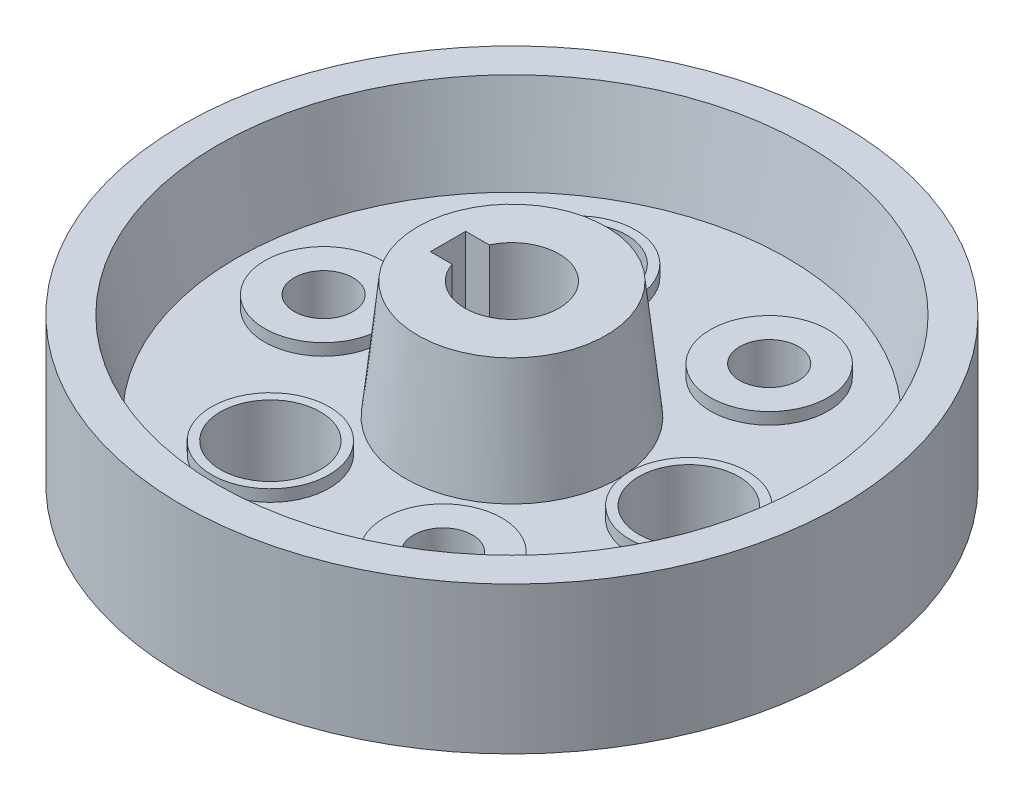
ISO-10303-21;
HEADER;
FILE_DESCRIPTION(('STEP AP214'),'2;1');
FILE_NAME('part.step','',(''),(''),'','','');
FILE_SCHEMA(('AUTOMOTIVE_DESIGN { 1 0 10303 214 1 1 1 1 }'));
ENDSEC;
DATA;
#1=APPLICATION_CONTEXT('core data for automotive mechanical design processes');
#2=APPLICATION_PROTOCOL_DEFINITION('international standard','automotive_design',2000,#1);
#3=PRODUCT_CONTEXT('',#1,'mechanical');
#4=PRODUCT('Part','Part','',(#3));
#5=PRODUCT_RELATED_PRODUCT_CATEGORY('part','',(#4));
#6=PRODUCT_DEFINITION_FORMATION('','',#4);
#7=PRODUCT_DEFINITION_CONTEXT('part definition',#1,'design');
#8=PRODUCT_DEFINITION('design','',#6,#7);
#9=PRODUCT_DEFINITION_SHAPE('','',#8);
#10=(LENGTH_UNIT() NAMED_UNIT(*) SI_UNIT(.MILLI.,.METRE.));
#11=(NAMED_UNIT(*) PLANE_ANGLE_UNIT() SI_UNIT($,.RADIAN.));
#12=(NAMED_UNIT(*) SI_UNIT($,.STERADIAN.) SOLID_ANGLE_UNIT());
#13=UNCERTAINTY_MEASURE_WITH_UNIT(LENGTH_MEASURE(1.E-05),#10,'distance_accuracy_value','');
#14=(GEOMETRIC_REPRESENTATION_CONTEXT(3) GLOBAL_UNCERTAINTY_ASSIGNED_CONTEXT((#13)) GLOBAL_UNIT_ASSIGNED_CONTEXT((#10,
#11,#12)) REPRESENTATION_CONTEXT('',''));
#15=CARTESIAN_POINT('',(0.,0.,0.));
#16=DIRECTION('',(0.,0.,1.));
#17=DIRECTION('',(1.,0.,0.));
#18=AXIS2_PLACEMENT_3D('',#15,#16,#17);
#19=CARTESIAN_POINT('',(56.,30.,0.));
#20=DIRECTION('',(0.,1.,0.));
#21=DIRECTION('',(-1.,0.,0.));
#22=AXIS2_PLACEMENT_3D('',#19,#20,#21);
#23=CYLINDRICAL_SURFACE('',#22,8.);
#24=DIRECTION('',(0.,1.,0.));
#25=VECTOR('',#24,1.);
#26=CARTESIAN_POINT('',(48.7544781875325,0.,-3.39152084838914));
#27=LINE('',#26,#25);
#28=CARTESIAN_POINT('',(48.7544781875325,3.00000000000001,-3.39152084838914));
#29=VERTEX_POINT('',#28);
#30=CARTESIAN_POINT('',(48.7544781875325,30.,-3.39152084838914));
#31=VERTEX_POINT('',#30);
#32=EDGE_CURVE('E108',#29,#31,#27,.T.);
#33=ORIENTED_EDGE('',*,*,#32,.F.);
#34=CARTESIAN_POINT('',(56.,3.00000000000001,0.));
#35=DIRECTION('',(0.,-1.,0.));
#36=DIRECTION('',(1.,0.,0.));
#37=AXIS2_PLACEMENT_3D('',#34,#35,#36);
#38=CIRCLE('',#37,8.);
#39=CARTESIAN_POINT('',(48.4372070955492,3.00000000000001,2.60847915161086));
#40=VERTEX_POINT('',#39);
#41=EDGE_CURVE('E60',#29,#40,#38,.T.);
#42=ORIENTED_EDGE('',*,*,#41,.T.);
#43=DIRECTION('',(0.,1.,0.));
#44=VECTOR('',#43,1.);
#45=CARTESIAN_POINT('',(48.4372070955492,30.,2.60847915161086));
#46=LINE('',#45,#44);
#47=CARTESIAN_POINT('',(48.4372070955492,30.,2.60847915161086));
#48=VERTEX_POINT('',#47);
#49=EDGE_CURVE('E112',#48,#40,#46,.F.);
#50=ORIENTED_EDGE('',*,*,#49,.F.);
#51=CARTESIAN_POINT('',(56.,30.,0.));
#52=DIRECTION('',(0.,1.,0.));
#53=DIRECTION('',(-1.,0.,0.));
#54=AXIS2_PLACEMENT_3D('',#51,#52,#53);
#55=CIRCLE('',#54,8.);
#56=EDGE_CURVE('E150',#48,#31,#55,.T.);
#57=ORIENTED_EDGE('',*,*,#56,.T.);
#58=EDGE_LOOP('',(#33,#42,#50,#57));
#59=FACE_BOUND('',#58,.T.);
#60=ADVANCED_FACE('F45',(#59),#23,.F.);
#61=CARTESIAN_POINT('',(48.7544781875325,0.,2.60847915161086));
#62=DIRECTION('',(0.,0.,1.));
#63=DIRECTION('',(1.,0.,0.));
#64=AXIS2_PLACEMENT_3D('',#61,#62,#63);
#65=PLANE('',#64);
#66=DIRECTION('',(1.,0.,0.));
#67=VECTOR('',#66,1.);
#68=CARTESIAN_POINT('',(48.7544781875325,3.00000000000001,2.60847915161086));
#69=LINE('',#68,#67);
#70=CARTESIAN_POINT('',(44.7562477490535,3.00000000000001,2.60847915161086));
#71=VERTEX_POINT('',#70);
#72=EDGE_CURVE('E100',#71,#40,#69,.T.);
#73=ORIENTED_EDGE('',*,*,#72,.F.);
#74=DIRECTION('',(0.,1.,0.));
#75=VECTOR('',#74,1.);
#76=CARTESIAN_POINT('',(44.7562477490535,0.,2.60847915161086));
#77=LINE('',#76,#75);
#78=CARTESIAN_POINT('',(44.7562477490535,30.,2.60847915161086));
#79=VERTEX_POINT('',#78);
#80=EDGE_CURVE('E98',#71,#79,#77,.T.);
#81=ORIENTED_EDGE('',*,*,#80,.T.);
#82=DIRECTION('',(1.,0.,0.));
#83=VECTOR('',#82,1.);
#84=CARTESIAN_POINT('',(48.7544781875325,30.,2.60847915161086));
#85=LINE('',#84,#83);
#86=EDGE_CURVE('E68',#79,#48,#85,.T.);
#87=ORIENTED_EDGE('',*,*,#86,.T.);
#88=ORIENTED_EDGE('',*,*,#49,.T.);
#89=EDGE_LOOP('',(#73,#81,#87,#88));
#90=FACE_BOUND('',#89,.T.);
#91=ADVANCED_FACE('F290',(#90),#65,.F.);
#92=CARTESIAN_POINT('',(44.7562477490535,0.,-3.39152084838914));
#93=DIRECTION('',(-1.,0.,0.));
#94=DIRECTION('',(0.,-1.,0.));
#95=AXIS2_PLACEMENT_3D('',#92,#93,#94);
#96=PLANE('',#95);
#97=DIRECTION('',(0.,0.,1.));
#98=VECTOR('',#97,1.);
#99=CARTESIAN_POINT('',(44.7562477490535,3.00000000000001,-3.39152084838914));
#100=LINE('',#99,#98);
#101=CARTESIAN_POINT('',(44.7562477490535,3.00000000000001,-3.39152084838914));
#102=VERTEX_POINT('',#101);
#103=EDGE_CURVE('E87',#102,#71,#100,.T.);
#104=ORIENTED_EDGE('',*,*,#103,.F.);
#105=DIRECTION('',(0.,1.,0.));
#106=VECTOR('',#105,1.);
#107=CARTESIAN_POINT('',(44.7562477490535,0.,-3.39152084838914));
#108=LINE('',#107,#106);
#109=CARTESIAN_POINT('',(44.7562477490535,30.,-3.39152084838914));
#110=VERTEX_POINT('',#109);
#111=EDGE_CURVE('E96',#102,#110,#108,.T.);
#112=ORIENTED_EDGE('',*,*,#111,.T.);
#113=DIRECTION('',(0.,0.,1.));
#114=VECTOR('',#113,1.);
#115=CARTESIAN_POINT('',(44.7562477490535,30.,-3.39152084838914));
#116=LINE('',#115,#114);
#117=EDGE_CURVE('E282',#110,#79,#116,.T.);
#118=ORIENTED_EDGE('',*,*,#117,.T.);
#119=ORIENTED_EDGE('',*,*,#80,.F.);
#120=EDGE_LOOP('',(#104,#112,#118,#119));
#121=FACE_BOUND('',#120,.T.);
#122=ADVANCED_FACE('F94',(#121),#96,.F.);
#123=CARTESIAN_POINT('',(48.7544781875325,0.,-3.39152084838914));
#124=DIRECTION('',(0.,0.,-1.));
#125=DIRECTION('',(-1.,0.,0.));
#126=AXIS2_PLACEMENT_3D('',#123,#124,#125);
#127=PLANE('',#126);
#128=DIRECTION('',(-1.,0.,0.));
#129=VECTOR('',#128,1.);
#130=CARTESIAN_POINT('',(48.7544781875325,3.00000000000001,-3.39152084838914));
#131=LINE('',#130,#129);
#132=EDGE_CURVE('E11',#29,#102,#131,.T.);
#133=ORIENTED_EDGE('',*,*,#132,.F.);
#134=ORIENTED_EDGE('',*,*,#32,.T.);
#135=DIRECTION('',(-1.,0.,0.));
#136=VECTOR('',#135,1.);
#137=CARTESIAN_POINT('',(48.7544781875325,30.,-3.39152084838914));
#138=LINE('',#137,#136);
#139=EDGE_CURVE('E105',#31,#110,#138,.T.);
#140=ORIENTED_EDGE('',*,*,#139,.T.);
#141=ORIENTED_EDGE('',*,*,#111,.F.);
#142=EDGE_LOOP('',(#133,#134,#140,#141));
#143=FACE_BOUND('',#142,.T.);
#144=ADVANCED_FACE('F103',(#143),#127,.F.);
#145=CARTESIAN_POINT('',(32.8666864261042,10.,0.));
#146=DIRECTION('',(0.,1.,0.));
#147=DIRECTION('',(-1.,0.,0.));
#148=AXIS2_PLACEMENT_3D('',#145,#146,#147);
#149=PLANE('',#148);
#150=CARTESIAN_POINT('',(72.0000000000001,10.,27.712812921102));
#151=DIRECTION('',(0.,1.,0.));
#152=DIRECTION('',(0.500000000000004,0.,0.866025403784436));
#153=AXIS2_PLACEMENT_3D('',#150,#151,#152);
#154=CIRCLE('',#153,10.);
#155=CARTESIAN_POINT('',(77.0000000000002,10.,36.3730669589463));
#156=VERTEX_POINT('',#155);
#157=EDGE_CURVE('E212',#156,#156,#154,.T.);
#158=ORIENTED_EDGE('',*,*,#157,.F.);
#159=EDGE_LOOP('',(#158));
#160=FACE_BOUND('',#159,.T.);
#161=CARTESIAN_POINT('',(56.,10.,0.));
#162=DIRECTION('',(0.,1.,0.));
#163=DIRECTION('',(-1.,0.,0.));
#164=AXIS2_PLACEMENT_3D('',#161,#162,#163);
#165=CIRCLE('',#164,18.1333135738958);
#166=CARTESIAN_POINT('',(37.8666864261042,10.,0.));
#167=VERTEX_POINT('',#166);
#168=EDGE_CURVE('E158',#167,#167,#165,.T.);
#169=ORIENTED_EDGE('',*,*,#168,.F.);
#170=EDGE_LOOP('',(#169));
#171=FACE_BOUND('',#170,.T.);
#172=CARTESIAN_POINT('',(56.,10.,0.));
#173=DIRECTION('',(0.,1.,0.));
#174=DIRECTION('',(-1.,0.,0.));
#175=AXIS2_PLACEMENT_3D('',#172,#173,#174);
#176=CIRCLE('',#175,46.7764705882353);
#177=CARTESIAN_POINT('',(9.22352941176471,10.,0.));
#178=VERTEX_POINT('',#177);
#179=EDGE_CURVE('E162',#178,#178,#176,.T.);
#180=ORIENTED_EDGE('',*,*,#179,.T.);
#181=EDGE_LOOP('',(#180));
#182=FACE_BOUND('',#181,.T.);
#183=CARTESIAN_POINT('',(40.9772805385395,10.,-26.0201133751031));
#184=DIRECTION('',(0.,1.,0.));
#185=DIRECTION('',(-1.,0.,0.));
#186=AXIS2_PLACEMENT_3D('',#183,#184,#185);
#187=CIRCLE('',#186,10.);
#188=CARTESIAN_POINT('',(30.9772805385395,10.,-26.0201133751031));
#189=VERTEX_POINT('',#188);
#190=EDGE_CURVE('E257',#189,#189,#187,.T.);
#191=ORIENTED_EDGE('',*,*,#190,.F.);
#192=EDGE_LOOP('',(#191));
#193=FACE_BOUND('',#192,.T.);
#194=CARTESIAN_POINT('',(86.0454389229208,10.,-4.30211422042248E-13));
#195=DIRECTION('',(0.,1.,0.));
#196=DIRECTION('',(-1.,0.,0.));
#197=AXIS2_PLACEMENT_3D('',#194,#195,#196);
#198=CIRCLE('',#197,9.99999999999999);
#199=CARTESIAN_POINT('',(76.0454389229208,10.,-4.30211422042248E-13));
#200=VERTEX_POINT('',#199);
#201=EDGE_CURVE('E253',#200,#200,#198,.T.);
#202=ORIENTED_EDGE('',*,*,#201,.F.);
#203=EDGE_LOOP('',(#202));
#204=FACE_BOUND('',#203,.T.);
#205=CARTESIAN_POINT('',(40.9772805385398,10.,26.0201133751034));
#206=DIRECTION('',(0.,1.,0.));
#207=DIRECTION('',(-1.,0.,0.));
#208=AXIS2_PLACEMENT_3D('',#205,#206,#207);
#209=CIRCLE('',#208,10.);
#210=CARTESIAN_POINT('',(30.9772805385398,10.,26.0201133751034));
#211=VERTEX_POINT('',#210);
#212=EDGE_CURVE('E245',#211,#211,#209,.T.);
#213=ORIENTED_EDGE('',*,*,#212,.F.);
#214=EDGE_LOOP('',(#213));
#215=FACE_BOUND('',#214,.T.);
#216=CARTESIAN_POINT('',(24.,10.,0.));
#217=DIRECTION('',(0.,1.,0.));
#218=DIRECTION('',(-1.,0.,0.));
#219=AXIS2_PLACEMENT_3D('',#216,#217,#218);
#220=CIRCLE('',#219,10.);
#221=CARTESIAN_POINT('',(14.,10.,0.));
#222=VERTEX_POINT('',#221);
#223=EDGE_CURVE('E224',#222,#222,#220,.T.);
#224=ORIENTED_EDGE('',*,*,#223,.F.);
#225=EDGE_LOOP('',(#224));
#226=FACE_BOUND('',#225,.T.);
#227=CARTESIAN_POINT('',(71.9999999999997,10.,-27.7128129211022));
#228=DIRECTION('',(0.,1.,0.));
#229=DIRECTION('',(0.499999999999992,0.,-0.866025403784443));
#230=AXIS2_PLACEMENT_3D('',#227,#228,#229);
#231=CIRCLE('',#230,10.);
#232=CARTESIAN_POINT('',(76.9999999999997,10.,-36.3730669589466));
#233=VERTEX_POINT('',#232);
#234=EDGE_CURVE('E195',#233,#233,#231,.T.);
#235=ORIENTED_EDGE('',*,*,#234,.F.);
#236=EDGE_LOOP('',(#235));
#237=FACE_BOUND('',#236,.T.);
#238=ADVANCED_FACE('F188',(#160,#171,#182,#193,#204,#215,#226,#237),#149,.T.);
#239=CARTESIAN_POINT('',(71.9999999999997,-20.,-27.7128129211022));
#240=DIRECTION('',(0.,1.,0.));
#241=DIRECTION('',(-1.,0.,0.));
#242=AXIS2_PLACEMENT_3D('',#239,#240,#241);
#243=CYLINDRICAL_SURFACE('',#242,5.);
#244=CARTESIAN_POINT('',(71.9999999999997,2.00000000000002,-27.7128129211022));
#245=DIRECTION('',(0.,-1.,0.));
#246=DIRECTION('',(1.,0.,0.));
#247=AXIS2_PLACEMENT_3D('',#244,#245,#246);
#248=CIRCLE('',#247,5.);
#249=CARTESIAN_POINT('',(76.9999999999997,2.00000000000002,-27.7128129211022));
#250=VERTEX_POINT('',#249);
#251=EDGE_CURVE('E145',#250,#250,#248,.F.);
#252=ORIENTED_EDGE('',*,*,#251,.F.);
#253=EDGE_LOOP('',(#252));
#254=FACE_BOUND('',#253,.T.);
#255=CARTESIAN_POINT('',(71.9999999999997,12.,-27.7128129211022));
#256=DIRECTION('',(0.,1.,0.));
#257=DIRECTION('',(0.499999999999992,0.,-0.866025403784443));
#258=AXIS2_PLACEMENT_3D('',#255,#256,#257);
#259=CIRCLE('',#258,5.);
#260=CARTESIAN_POINT('',(74.4999999999997,12.,-32.0429399400244));
#261=VERTEX_POINT('',#260);
#262=EDGE_CURVE('E192',#261,#261,#259,.T.);
#263=ORIENTED_EDGE('',*,*,#262,.T.);
#264=EDGE_LOOP('',(#263));
#265=FACE_BOUND('',#264,.T.);
#266=ADVANCED_FACE('F184',(#254,#265),#243,.F.);
#267=CARTESIAN_POINT('',(72.0000000000001,-20.,27.712812921102));
#268=DIRECTION('',(0.,1.,0.));
#269=DIRECTION('',(-1.,0.,0.));
#270=AXIS2_PLACEMENT_3D('',#267,#268,#269);
#271=CYLINDRICAL_SURFACE('',#270,5.);
#272=CARTESIAN_POINT('',(72.0000000000001,2.00000000000002,27.712812921102));
#273=DIRECTION('',(0.,-1.,0.));
#274=DIRECTION('',(1.,0.,0.));
#275=AXIS2_PLACEMENT_3D('',#272,#273,#274);
#276=CIRCLE('',#275,5.);
#277=CARTESIAN_POINT('',(77.0000000000001,2.00000000000002,27.712812921102));
#278=VERTEX_POINT('',#277);
#279=EDGE_CURVE('E124',#278,#278,#276,.F.);
#280=ORIENTED_EDGE('',*,*,#279,.F.);
#281=EDGE_LOOP('',(#280));
#282=FACE_BOUND('',#281,.T.);
#283=CARTESIAN_POINT('',(72.0000000000001,12.,27.712812921102));
#284=DIRECTION('',(0.,1.,0.));
#285=DIRECTION('',(0.500000000000004,0.,0.866025403784436));
#286=AXIS2_PLACEMENT_3D('',#283,#284,#285);
#287=CIRCLE('',#286,5.);
#288=CARTESIAN_POINT('',(74.5000000000001,12.,32.0429399400241));
#289=VERTEX_POINT('',#288);
#290=EDGE_CURVE('E207',#289,#289,#287,.T.);
#291=ORIENTED_EDGE('',*,*,#290,.T.);
#292=EDGE_LOOP('',(#291));
#293=FACE_BOUND('',#292,.T.);
#294=ADVANCED_FACE('F187',(#282,#293),#271,.F.);
#295=CARTESIAN_POINT('',(24.,-20.,0.));
#296=DIRECTION('',(0.,1.,0.));
#297=DIRECTION('',(-1.,0.,0.));
#298=AXIS2_PLACEMENT_3D('',#295,#296,#297);
#299=CYLINDRICAL_SURFACE('',#298,5.);
#300=CARTESIAN_POINT('',(24.,2.00000000000001,0.));
#301=DIRECTION('',(0.,-1.,0.));
#302=DIRECTION('',(1.,0.,0.));
#303=AXIS2_PLACEMENT_3D('',#300,#301,#302);
#304=CIRCLE('',#303,5.);
#305=CARTESIAN_POINT('',(29.,2.00000000000001,0.));
#306=VERTEX_POINT('',#305);
#307=EDGE_CURVE('E140',#306,#306,#304,.F.);
#308=ORIENTED_EDGE('',*,*,#307,.F.);
#309=EDGE_LOOP('',(#308));
#310=FACE_BOUND('',#309,.T.);
#311=CARTESIAN_POINT('',(24.,12.,0.));
#312=DIRECTION('',(0.,1.,0.));
#313=DIRECTION('',(-1.,0.,0.));
#314=AXIS2_PLACEMENT_3D('',#311,#312,#313);
#315=CIRCLE('',#314,5.);
#316=CARTESIAN_POINT('',(19.,12.,0.));
#317=VERTEX_POINT('',#316);
#318=EDGE_CURVE('E217',#317,#317,#315,.T.);
#319=ORIENTED_EDGE('',*,*,#318,.T.);
#320=EDGE_LOOP('',(#319));
#321=FACE_BOUND('',#320,.T.);
#322=ADVANCED_FACE('F330',(#310,#321),#299,.F.);
#323=CARTESIAN_POINT('',(56.,30.,0.));
#324=DIRECTION('',(0.,1.,0.));
#325=DIRECTION('',(-1.,0.,0.));
#326=AXIS2_PLACEMENT_3D('',#323,#324,#325);
#327=CYLINDRICAL_SURFACE('',#326,56.);
#328=CARTESIAN_POINT('',(56.,0.,0.));
#329=DIRECTION('',(0.,1.,0.));
#330=DIRECTION('',(-1.,0.,0.));
#331=AXIS2_PLACEMENT_3D('',#328,#329,#330);
#332=CIRCLE('',#331,56.);
#333=CARTESIAN_POINT('',(0.,0.,0.));
#334=VERTEX_POINT('',#333);
#335=EDGE_CURVE('E146',#334,#334,#332,.T.);
#336=ORIENTED_EDGE('',*,*,#335,.T.);
#337=EDGE_LOOP('',(#336));
#338=FACE_BOUND('',#337,.T.);
#339=CARTESIAN_POINT('',(56.,25.,0.));
#340=DIRECTION('',(0.,1.,0.));
#341=DIRECTION('',(-1.,0.,0.));
#342=AXIS2_PLACEMENT_3D('',#339,#340,#341);
#343=CIRCLE('',#342,56.);
#344=CARTESIAN_POINT('',(0.,25.,0.));
#345=VERTEX_POINT('',#344);
#346=EDGE_CURVE('E54',#345,#345,#343,.T.);
#347=ORIENTED_EDGE('',*,*,#346,.F.);
#348=EDGE_LOOP('',(#347));
#349=FACE_BOUND('',#348,.T.);
#350=ADVANCED_FACE('F47',(#338,#349),#327,.T.);
#351=CARTESIAN_POINT('',(0.,25.,0.));
#352=DIRECTION('',(0.,1.,0.));
#353=DIRECTION('',(-1.,0.,0.));
#354=AXIS2_PLACEMENT_3D('',#351,#352,#353);
#355=PLANE('',#354);
#356=ORIENTED_EDGE('',*,*,#346,.T.);
#357=EDGE_LOOP('',(#356));
#358=FACE_BOUND('',#357,.T.);
#359=CARTESIAN_POINT('',(56.,25.,0.));
#360=DIRECTION('',(0.,1.,0.));
#361=DIRECTION('',(-1.,0.,0.));
#362=AXIS2_PLACEMENT_3D('',#359,#360,#361);
#363=CIRCLE('',#362,50.);
#364=CARTESIAN_POINT('',(6.,25.,0.));
#365=VERTEX_POINT('',#364);
#366=EDGE_CURVE('E166',#365,#365,#363,.T.);
#367=ORIENTED_EDGE('',*,*,#366,.F.);
#368=EDGE_LOOP('',(#367));
#369=FACE_BOUND('',#368,.T.);
#370=ADVANCED_FACE('F329',(#358,#369),#355,.T.);
#371=CARTESIAN_POINT('',(56.,10.,0.));
#372=DIRECTION('',(0.,1.,0.));
#373=DIRECTION('',(-1.,0.,0.));
#374=AXIS2_PLACEMENT_3D('',#371,#372,#373);
#375=CONICAL_SURFACE('',#374,46.7764705882353,0.211682450549624);
#376=ORIENTED_EDGE('',*,*,#366,.T.);
#377=EDGE_LOOP('',(#376));
#378=FACE_BOUND('',#377,.T.);
#379=ORIENTED_EDGE('',*,*,#179,.F.);
#380=EDGE_LOOP('',(#379));
#381=FACE_BOUND('',#380,.T.);
#382=ADVANCED_FACE('F335',(#378,#381),#375,.F.);
#383=CARTESIAN_POINT('',(56.,30.,0.));
#384=DIRECTION('',(0.,-1.,0.));
#385=DIRECTION('',(1.,0.,0.));
#386=AXIS2_PLACEMENT_3D('',#383,#384,#385);
#387=CONICAL_SURFACE('',#386,16.,0.106263886033565);
#388=ORIENTED_EDGE('',*,*,#168,.T.);
#389=EDGE_LOOP('',(#388));
#390=FACE_BOUND('',#389,.T.);
#391=CARTESIAN_POINT('',(56.,30.,0.));
#392=DIRECTION('',(0.,1.,0.));
#393=DIRECTION('',(-1.,0.,0.));
#394=AXIS2_PLACEMENT_3D('',#391,#392,#393);
#395=CIRCLE('',#394,16.);
#396=CARTESIAN_POINT('',(40.,30.,0.));
#397=VERTEX_POINT('',#396);
#398=EDGE_CURVE('E154',#397,#397,#395,.T.);
#399=ORIENTED_EDGE('',*,*,#398,.F.);
#400=EDGE_LOOP('',(#399));
#401=FACE_BOUND('',#400,.T.);
#402=ADVANCED_FACE('F340',(#390,#401),#387,.T.);
#403=CARTESIAN_POINT('',(40.,30.,0.));
#404=DIRECTION('',(0.,1.,0.));
#405=DIRECTION('',(-1.,0.,0.));
#406=AXIS2_PLACEMENT_3D('',#403,#404,#405);
#407=PLANE('',#406);
#408=ORIENTED_EDGE('',*,*,#86,.F.);
#409=ORIENTED_EDGE('',*,*,#117,.F.);
#410=ORIENTED_EDGE('',*,*,#139,.F.);
#411=ORIENTED_EDGE('',*,*,#56,.F.);
#412=EDGE_LOOP('',(#408,#409,#410,#411));
#413=FACE_BOUND('',#412,.T.);
#414=ORIENTED_EDGE('',*,*,#398,.T.);
#415=EDGE_LOOP('',(#414));
#416=FACE_BOUND('',#415,.T.);
#417=ADVANCED_FACE('F287',(#413,#416),#407,.T.);
#418=CARTESIAN_POINT('',(0.,0.,0.));
#419=DIRECTION('',(0.,-1.,0.));
#420=DIRECTION('',(1.,0.,0.));
#421=AXIS2_PLACEMENT_3D('',#418,#419,#420);
#422=PLANE('',#421);
#423=CARTESIAN_POINT('',(56.,0.,0.));
#424=DIRECTION('',(0.,-1.,0.));
#425=DIRECTION('',(1.,0.,0.));
#426=AXIS2_PLACEMENT_3D('',#423,#424,#425);
#427=CIRCLE('',#426,17.5);
#428=CARTESIAN_POINT('',(73.5,0.,0.));
#429=VERTEX_POINT('',#428);
#430=EDGE_CURVE('E293',#429,#429,#427,.T.);
#431=ORIENTED_EDGE('',*,*,#430,.F.);
#432=EDGE_LOOP('',(#431));
#433=FACE_BOUND('',#432,.T.);
#434=CARTESIAN_POINT('',(40.9772805385398,0.,26.0201133751034));
#435=DIRECTION('',(0.,1.,0.));
#436=DIRECTION('',(0.500000000000004,0.,0.866025403784436));
#437=AXIS2_PLACEMENT_3D('',#434,#435,#436);
#438=CIRCLE('',#437,8.50000000000001);
#439=CARTESIAN_POINT('',(45.2272805385399,0.,33.3813293072711));
#440=VERTEX_POINT('',#439);
#441=EDGE_CURVE('E269',#440,#440,#438,.T.);
#442=ORIENTED_EDGE('',*,*,#441,.T.);
#443=EDGE_LOOP('',(#442));
#444=FACE_BOUND('',#443,.T.);
#445=CARTESIAN_POINT('',(86.0454389229208,0.,-4.30191391180932E-13));
#446=DIRECTION('',(0.,1.,0.));
#447=DIRECTION('',(0.499999999999992,0.,-0.866025403784443));
#448=AXIS2_PLACEMENT_3D('',#445,#446,#447);
#449=CIRCLE('',#448,8.50000000000001);
#450=CARTESIAN_POINT('',(90.2954389229208,0.,-7.36121593216821));
#451=VERTEX_POINT('',#450);
#452=EDGE_CURVE('E265',#451,#451,#449,.T.);
#453=ORIENTED_EDGE('',*,*,#452,.T.);
#454=EDGE_LOOP('',(#453));
#455=FACE_BOUND('',#454,.T.);
#456=CARTESIAN_POINT('',(40.9772805385395,0.,-26.0201133751031));
#457=DIRECTION('',(0.,1.,0.));
#458=DIRECTION('',(-1.,0.,0.));
#459=AXIS2_PLACEMENT_3D('',#456,#457,#458);
#460=CIRCLE('',#459,8.50000000000001);
#461=CARTESIAN_POINT('',(32.4772805385394,0.,-26.0201133751031));
#462=VERTEX_POINT('',#461);
#463=EDGE_CURVE('E273',#462,#462,#460,.T.);
#464=ORIENTED_EDGE('',*,*,#463,.T.);
#465=EDGE_LOOP('',(#464));
#466=FACE_BOUND('',#465,.T.);
#467=CARTESIAN_POINT('',(72.0000000000001,0.,27.712812921102));
#468=DIRECTION('',(0.,-1.,0.));
#469=DIRECTION('',(-0.500000000000004,0.,-0.866025403784436));
#470=AXIS2_PLACEMENT_3D('',#467,#468,#469);
#471=CIRCLE('',#470,6.);
#472=CARTESIAN_POINT('',(69.0000000000001,0.,22.5166604983953));
#473=VERTEX_POINT('',#472);
#474=EDGE_CURVE('E125',#473,#473,#471,.T.);
#475=ORIENTED_EDGE('',*,*,#474,.F.);
#476=EDGE_LOOP('',(#475));
#477=FACE_BOUND('',#476,.T.);
#478=CARTESIAN_POINT('',(71.9999999999997,0.,-27.7128129211022));
#479=DIRECTION('',(0.,-1.,0.));
#480=DIRECTION('',(-0.499999999999992,0.,0.866025403784443));
#481=AXIS2_PLACEMENT_3D('',#478,#479,#480);
#482=CIRCLE('',#481,6.);
#483=CARTESIAN_POINT('',(68.9999999999998,0.,-22.5166604983955));
#484=VERTEX_POINT('',#483);
#485=EDGE_CURVE('E119',#484,#484,#482,.T.);
#486=ORIENTED_EDGE('',*,*,#485,.F.);
#487=EDGE_LOOP('',(#486));
#488=FACE_BOUND('',#487,.T.);
#489=CARTESIAN_POINT('',(24.,0.,0.));
#490=DIRECTION('',(0.,-1.,0.));
#491=DIRECTION('',(1.,0.,0.));
#492=AXIS2_PLACEMENT_3D('',#489,#490,#491);
#493=CIRCLE('',#492,6.);
#494=CARTESIAN_POINT('',(30.,0.,0.));
#495=VERTEX_POINT('',#494);
#496=EDGE_CURVE('E141',#495,#495,#493,.T.);
#497=ORIENTED_EDGE('',*,*,#496,.F.);
#498=EDGE_LOOP('',(#497));
#499=FACE_BOUND('',#498,.T.);
#500=ORIENTED_EDGE('',*,*,#335,.F.);
#501=EDGE_LOOP('',(#500));
#502=FACE_BOUND('',#501,.T.);
#503=ADVANCED_FACE('F308',(#433,#444,#455,#466,#477,#488,#499,#502),#422,.T.);
#504=CARTESIAN_POINT('',(24.,2.00000000000001,0.));
#505=DIRECTION('',(0.,-1.,0.));
#506=DIRECTION('',(1.,0.,0.));
#507=AXIS2_PLACEMENT_3D('',#504,#505,#506);
#508=PLANE('',#507);
#509=CARTESIAN_POINT('',(24.,2.00000000000001,0.));
#510=DIRECTION('',(0.,-1.,0.));
#511=DIRECTION('',(1.,0.,0.));
#512=AXIS2_PLACEMENT_3D('',#509,#510,#511);
#513=CIRCLE('',#512,6.);
#514=CARTESIAN_POINT('',(30.,2.00000000000001,0.));
#515=VERTEX_POINT('',#514);
#516=EDGE_CURVE('E136',#515,#515,#513,.T.);
#517=ORIENTED_EDGE('',*,*,#516,.T.);
#518=EDGE_LOOP('',(#517));
#519=FACE_BOUND('',#518,.T.);
#520=ORIENTED_EDGE('',*,*,#307,.T.);
#521=EDGE_LOOP('',(#520));
#522=FACE_BOUND('',#521,.T.);
#523=ADVANCED_FACE('F311',(#519,#522),#508,.T.);
#524=CARTESIAN_POINT('',(24.,2.00000000000001,0.));
#525=DIRECTION('',(0.,-1.,0.));
#526=DIRECTION('',(1.,0.,0.));
#527=AXIS2_PLACEMENT_3D('',#524,#525,#526);
#528=CYLINDRICAL_SURFACE('',#527,6.);
#529=ORIENTED_EDGE('',*,*,#516,.F.);
#530=EDGE_LOOP('',(#529));
#531=FACE_BOUND('',#530,.T.);
#532=ORIENTED_EDGE('',*,*,#496,.T.);
#533=EDGE_LOOP('',(#532));
#534=FACE_BOUND('',#533,.T.);
#535=ADVANCED_FACE('F404',(#531,#534),#528,.F.);
#536=CARTESIAN_POINT('',(72.0000000000001,2.00000000000002,27.712812921102));
#537=DIRECTION('',(0.,-1.,0.));
#538=DIRECTION('',(-0.500000000000004,0.,-0.866025403784436));
#539=AXIS2_PLACEMENT_3D('',#536,#537,#538);
#540=PLANE('',#539);
#541=CARTESIAN_POINT('',(72.0000000000001,2.00000000000002,27.712812921102));
#542=DIRECTION('',(0.,-1.,0.));
#543=DIRECTION('',(-0.500000000000004,0.,-0.866025403784436));
#544=AXIS2_PLACEMENT_3D('',#541,#542,#543);
#545=CIRCLE('',#544,6.);
#546=CARTESIAN_POINT('',(69.0000000000001,2.00000000000002,22.5166604983953));
#547=VERTEX_POINT('',#546);
#548=EDGE_CURVE('E120',#547,#547,#545,.T.);
#549=ORIENTED_EDGE('',*,*,#548,.T.);
#550=EDGE_LOOP('',(#549));
#551=FACE_BOUND('',#550,.T.);
#552=ORIENTED_EDGE('',*,*,#279,.T.);
#553=EDGE_LOOP('',(#552));
#554=FACE_BOUND('',#553,.T.);
#555=ADVANCED_FACE('F412',(#551,#554),#540,.T.);
#556=CARTESIAN_POINT('',(72.0000000000001,2.00000000000002,27.712812921102));
#557=DIRECTION('',(0.,-1.,0.));
#558=DIRECTION('',(1.,0.,0.));
#559=AXIS2_PLACEMENT_3D('',#556,#557,#558);
#560=CYLINDRICAL_SURFACE('',#559,6.);
#561=ORIENTED_EDGE('',*,*,#548,.F.);
#562=EDGE_LOOP('',(#561));
#563=FACE_BOUND('',#562,.T.);
#564=ORIENTED_EDGE('',*,*,#474,.T.);
#565=EDGE_LOOP('',(#564));
#566=FACE_BOUND('',#565,.T.);
#567=ADVANCED_FACE('F420',(#563,#566),#560,.F.);
#568=CARTESIAN_POINT('',(71.9999999999997,2.00000000000002,-27.7128129211022));
#569=DIRECTION('',(0.,-1.,0.));
#570=DIRECTION('',(-0.499999999999992,0.,0.866025403784443));
#571=AXIS2_PLACEMENT_3D('',#568,#569,#570);
#572=PLANE('',#571);
#573=CARTESIAN_POINT('',(71.9999999999997,2.00000000000002,-27.7128129211022));
#574=DIRECTION('',(0.,-1.,0.));
#575=DIRECTION('',(-0.499999999999992,0.,0.866025403784443));
#576=AXIS2_PLACEMENT_3D('',#573,#574,#575);
#577=CIRCLE('',#576,6.);
#578=CARTESIAN_POINT('',(68.9999999999998,2.00000000000002,-22.5166604983955));
#579=VERTEX_POINT('',#578);
#580=EDGE_CURVE('E129',#579,#579,#577,.T.);
#581=ORIENTED_EDGE('',*,*,#580,.T.);
#582=EDGE_LOOP('',(#581));
#583=FACE_BOUND('',#582,.T.);
#584=ORIENTED_EDGE('',*,*,#251,.T.);
#585=EDGE_LOOP('',(#584));
#586=FACE_BOUND('',#585,.T.);
#587=ADVANCED_FACE('F182',(#583,#586),#572,.T.);
#588=CARTESIAN_POINT('',(71.9999999999997,2.00000000000002,-27.7128129211022));
#589=DIRECTION('',(0.,-1.,0.));
#590=DIRECTION('',(1.,0.,0.));
#591=AXIS2_PLACEMENT_3D('',#588,#589,#590);
#592=CYLINDRICAL_SURFACE('',#591,6.);
#593=ORIENTED_EDGE('',*,*,#580,.F.);
#594=EDGE_LOOP('',(#593));
#595=FACE_BOUND('',#594,.T.);
#596=ORIENTED_EDGE('',*,*,#485,.T.);
#597=EDGE_LOOP('',(#596));
#598=FACE_BOUND('',#597,.T.);
#599=ADVANCED_FACE('F435',(#595,#598),#592,.F.);
#600=CARTESIAN_POINT('',(40.9772805385395,0.,-26.0201133751031));
#601=DIRECTION('',(0.,1.,0.));
#602=DIRECTION('',(-1.,0.,0.));
#603=AXIS2_PLACEMENT_3D('',#600,#601,#602);
#604=CYLINDRICAL_SURFACE('',#603,8.50000000000001);
#605=ORIENTED_EDGE('',*,*,#463,.F.);
#606=EDGE_LOOP('',(#605));
#607=FACE_BOUND('',#606,.T.);
#608=CARTESIAN_POINT('',(40.9772805385395,12.,-26.0201133751031));
#609=DIRECTION('',(0.,1.,0.));
#610=DIRECTION('',(-1.,0.,0.));
#611=AXIS2_PLACEMENT_3D('',#608,#609,#610);
#612=CIRCLE('',#611,8.5);
#613=CARTESIAN_POINT('',(32.4772805385395,12.,-26.0201133751031));
#614=VERTEX_POINT('',#613);
#615=EDGE_CURVE('E233',#614,#614,#612,.T.);
#616=ORIENTED_EDGE('',*,*,#615,.T.);
#617=EDGE_LOOP('',(#616));
#618=FACE_BOUND('',#617,.T.);
#619=ADVANCED_FACE('F443',(#607,#618),#604,.F.);
#620=CARTESIAN_POINT('',(86.0454389229208,0.,-4.30191391180932E-13));
#621=DIRECTION('',(0.,1.,0.));
#622=DIRECTION('',(-1.,0.,0.));
#623=AXIS2_PLACEMENT_3D('',#620,#621,#622);
#624=CYLINDRICAL_SURFACE('',#623,8.50000000000001);
#625=ORIENTED_EDGE('',*,*,#452,.F.);
#626=EDGE_LOOP('',(#625));
#627=FACE_BOUND('',#626,.T.);
#628=CARTESIAN_POINT('',(86.0454389229208,12.,-4.30211422042248E-13));
#629=DIRECTION('',(0.,1.,0.));
#630=DIRECTION('',(-1.,0.,0.));
#631=AXIS2_PLACEMENT_3D('',#628,#629,#630);
#632=CIRCLE('',#631,8.50000000000001);
#633=CARTESIAN_POINT('',(77.5454389229208,12.,-4.30211422042248E-13));
#634=VERTEX_POINT('',#633);
#635=EDGE_CURVE('E229',#634,#634,#632,.T.);
#636=ORIENTED_EDGE('',*,*,#635,.T.);
#637=EDGE_LOOP('',(#636));
#638=FACE_BOUND('',#637,.T.);
#639=ADVANCED_FACE('F451',(#627,#638),#624,.F.);
#640=CARTESIAN_POINT('',(40.9772805385398,0.,26.0201133751034));
#641=DIRECTION('',(0.,1.,0.));
#642=DIRECTION('',(-1.,0.,0.));
#643=AXIS2_PLACEMENT_3D('',#640,#641,#642);
#644=CYLINDRICAL_SURFACE('',#643,8.50000000000001);
#645=ORIENTED_EDGE('',*,*,#441,.F.);
#646=EDGE_LOOP('',(#645));
#647=FACE_BOUND('',#646,.T.);
#648=CARTESIAN_POINT('',(40.9772805385398,12.,26.0201133751034));
#649=DIRECTION('',(0.,1.,0.));
#650=DIRECTION('',(-1.,0.,0.));
#651=AXIS2_PLACEMENT_3D('',#648,#649,#650);
#652=CIRCLE('',#651,8.5);
#653=CARTESIAN_POINT('',(32.4772805385398,12.,26.0201133751034));
#654=VERTEX_POINT('',#653);
#655=EDGE_CURVE('E238',#654,#654,#652,.T.);
#656=ORIENTED_EDGE('',*,*,#655,.T.);
#657=EDGE_LOOP('',(#656));
#658=FACE_BOUND('',#657,.T.);
#659=ADVANCED_FACE('F459',(#647,#658),#644,.F.);
#660=CARTESIAN_POINT('',(40.9772805385395,12.,-26.0201133751031));
#661=DIRECTION('',(0.,-1.,0.));
#662=DIRECTION('',(1.,0.,0.));
#663=AXIS2_PLACEMENT_3D('',#660,#661,#662);
#664=CYLINDRICAL_SURFACE('',#663,10.);
#665=CARTESIAN_POINT('',(40.9772805385395,12.,-26.0201133751031));
#666=DIRECTION('',(0.,1.,0.));
#667=DIRECTION('',(-1.,0.,0.));
#668=AXIS2_PLACEMENT_3D('',#665,#666,#667);
#669=CIRCLE('',#668,10.);
#670=CARTESIAN_POINT('',(30.9772805385395,12.,-26.0201133751031));
#671=VERTEX_POINT('',#670);
#672=EDGE_CURVE('E261',#671,#671,#669,.T.);
#673=ORIENTED_EDGE('',*,*,#672,.F.);
#674=EDGE_LOOP('',(#673));
#675=FACE_BOUND('',#674,.T.);
#676=ORIENTED_EDGE('',*,*,#190,.T.);
#677=EDGE_LOOP('',(#676));
#678=FACE_BOUND('',#677,.T.);
#679=ADVANCED_FACE('F467',(#675,#678),#664,.T.);
#680=CARTESIAN_POINT('',(40.9772805385395,12.,-26.0201133751031));
#681=DIRECTION('',(0.,1.,0.));
#682=DIRECTION('',(-1.,0.,0.));
#683=AXIS2_PLACEMENT_3D('',#680,#681,#682);
#684=PLANE('',#683);
#685=ORIENTED_EDGE('',*,*,#615,.F.);
#686=EDGE_LOOP('',(#685));
#687=FACE_BOUND('',#686,.T.);
#688=ORIENTED_EDGE('',*,*,#672,.T.);
#689=EDGE_LOOP('',(#688));
#690=FACE_BOUND('',#689,.T.);
#691=ADVANCED_FACE('F475',(#687,#690),#684,.T.);
#692=CARTESIAN_POINT('',(86.0454389229208,12.,-4.30211422042248E-13));
#693=DIRECTION('',(0.,-1.,0.));
#694=DIRECTION('',(1.,0.,0.));
#695=AXIS2_PLACEMENT_3D('',#692,#693,#694);
#696=CYLINDRICAL_SURFACE('',#695,9.99999999999999);
#697=CARTESIAN_POINT('',(86.0454389229208,12.,-4.30211422042248E-13));
#698=DIRECTION('',(0.,1.,0.));
#699=DIRECTION('',(-1.,0.,0.));
#700=AXIS2_PLACEMENT_3D('',#697,#698,#699);
#701=CIRCLE('',#700,9.99999999999999);
#702=CARTESIAN_POINT('',(76.0454389229208,12.,-4.30211422042248E-13));
#703=VERTEX_POINT('',#702);
#704=EDGE_CURVE('E249',#703,#703,#701,.T.);
#705=ORIENTED_EDGE('',*,*,#704,.F.);
#706=EDGE_LOOP('',(#705));
#707=FACE_BOUND('',#706,.T.);
#708=ORIENTED_EDGE('',*,*,#201,.T.);
#709=EDGE_LOOP('',(#708));
#710=FACE_BOUND('',#709,.T.);
#711=ADVANCED_FACE('F483',(#707,#710),#696,.T.);
#712=CARTESIAN_POINT('',(86.0454389229208,12.,-4.30211422042248E-13));
#713=DIRECTION('',(0.,1.,0.));
#714=DIRECTION('',(-1.,0.,0.));
#715=AXIS2_PLACEMENT_3D('',#712,#713,#714);
#716=PLANE('',#715);
#717=ORIENTED_EDGE('',*,*,#635,.F.);
#718=EDGE_LOOP('',(#717));
#719=FACE_BOUND('',#718,.T.);
#720=ORIENTED_EDGE('',*,*,#704,.T.);
#721=EDGE_LOOP('',(#720));
#722=FACE_BOUND('',#721,.T.);
#723=ADVANCED_FACE('F491',(#719,#722),#716,.T.);
#724=CARTESIAN_POINT('',(40.9772805385398,12.,26.0201133751034));
#725=DIRECTION('',(0.,-1.,0.));
#726=DIRECTION('',(1.,0.,0.));
#727=AXIS2_PLACEMENT_3D('',#724,#725,#726);
#728=CYLINDRICAL_SURFACE('',#727,10.);
#729=CARTESIAN_POINT('',(40.9772805385398,12.,26.0201133751034));
#730=DIRECTION('',(0.,1.,0.));
#731=DIRECTION('',(-1.,0.,0.));
#732=AXIS2_PLACEMENT_3D('',#729,#730,#731);
#733=CIRCLE('',#732,10.);
#734=CARTESIAN_POINT('',(30.9772805385398,12.,26.0201133751034));
#735=VERTEX_POINT('',#734);
#736=EDGE_CURVE('E237',#735,#735,#733,.T.);
#737=ORIENTED_EDGE('',*,*,#736,.F.);
#738=EDGE_LOOP('',(#737));
#739=FACE_BOUND('',#738,.T.);
#740=ORIENTED_EDGE('',*,*,#212,.T.);
#741=EDGE_LOOP('',(#740));
#742=FACE_BOUND('',#741,.T.);
#743=ADVANCED_FACE('F499',(#739,#742),#728,.T.);
#744=CARTESIAN_POINT('',(40.9772805385398,12.,26.0201133751034));
#745=DIRECTION('',(0.,1.,0.));
#746=DIRECTION('',(-1.,0.,0.));
#747=AXIS2_PLACEMENT_3D('',#744,#745,#746);
#748=PLANE('',#747);
#749=ORIENTED_EDGE('',*,*,#655,.F.);
#750=EDGE_LOOP('',(#749));
#751=FACE_BOUND('',#750,.T.);
#752=ORIENTED_EDGE('',*,*,#736,.T.);
#753=EDGE_LOOP('',(#752));
#754=FACE_BOUND('',#753,.T.);
#755=ADVANCED_FACE('F507',(#751,#754),#748,.T.);
#756=CARTESIAN_POINT('',(24.,12.,0.));
#757=DIRECTION('',(0.,1.,0.));
#758=DIRECTION('',(-1.,0.,0.));
#759=AXIS2_PLACEMENT_3D('',#756,#757,#758);
#760=PLANE('',#759);
#761=CARTESIAN_POINT('',(24.,12.,0.));
#762=DIRECTION('',(0.,1.,0.));
#763=DIRECTION('',(-1.,0.,0.));
#764=AXIS2_PLACEMENT_3D('',#761,#762,#763);
#765=CIRCLE('',#764,10.);
#766=CARTESIAN_POINT('',(14.,12.,0.));
#767=VERTEX_POINT('',#766);
#768=EDGE_CURVE('E225',#767,#767,#765,.T.);
#769=ORIENTED_EDGE('',*,*,#768,.T.);
#770=EDGE_LOOP('',(#769));
#771=FACE_BOUND('',#770,.T.);
#772=ORIENTED_EDGE('',*,*,#318,.F.);
#773=EDGE_LOOP('',(#772));
#774=FACE_BOUND('',#773,.T.);
#775=ADVANCED_FACE('F515',(#771,#774),#760,.T.);
#776=CARTESIAN_POINT('',(24.,12.,0.));
#777=DIRECTION('',(0.,-1.,0.));
#778=DIRECTION('',(1.,0.,0.));
#779=AXIS2_PLACEMENT_3D('',#776,#777,#778);
#780=CYLINDRICAL_SURFACE('',#779,10.);
#781=ORIENTED_EDGE('',*,*,#768,.F.);
#782=EDGE_LOOP('',(#781));
#783=FACE_BOUND('',#782,.T.);
#784=ORIENTED_EDGE('',*,*,#223,.T.);
#785=EDGE_LOOP('',(#784));
#786=FACE_BOUND('',#785,.T.);
#787=ADVANCED_FACE('F523',(#783,#786),#780,.T.);
#788=CARTESIAN_POINT('',(72.0000000000001,12.,27.712812921102));
#789=DIRECTION('',(0.,1.,0.));
#790=DIRECTION('',(0.500000000000004,0.,0.866025403784436));
#791=AXIS2_PLACEMENT_3D('',#788,#789,#790);
#792=PLANE('',#791);
#793=CARTESIAN_POINT('',(72.0000000000001,12.,27.712812921102));
#794=DIRECTION('',(0.,1.,0.));
#795=DIRECTION('',(0.500000000000004,0.,0.866025403784436));
#796=AXIS2_PLACEMENT_3D('',#793,#794,#795);
#797=CIRCLE('',#796,10.);
#798=CARTESIAN_POINT('',(77.0000000000002,12.,36.3730669589463));
#799=VERTEX_POINT('',#798);
#800=EDGE_CURVE('E213',#799,#799,#797,.T.);
#801=ORIENTED_EDGE('',*,*,#800,.T.);
#802=EDGE_LOOP('',(#801));
#803=FACE_BOUND('',#802,.T.);
#804=ORIENTED_EDGE('',*,*,#290,.F.);
#805=EDGE_LOOP('',(#804));
#806=FACE_BOUND('',#805,.T.);
#807=ADVANCED_FACE('F531',(#803,#806),#792,.T.);
#808=CARTESIAN_POINT('',(72.0000000000001,12.,27.712812921102));
#809=DIRECTION('',(0.,-1.,0.));
#810=DIRECTION('',(1.,0.,0.));
#811=AXIS2_PLACEMENT_3D('',#808,#809,#810);
#812=CYLINDRICAL_SURFACE('',#811,10.);
#813=ORIENTED_EDGE('',*,*,#800,.F.);
#814=EDGE_LOOP('',(#813));
#815=FACE_BOUND('',#814,.T.);
#816=ORIENTED_EDGE('',*,*,#157,.T.);
#817=EDGE_LOOP('',(#816));
#818=FACE_BOUND('',#817,.T.);
#819=ADVANCED_FACE('F365',(#815,#818),#812,.T.);
#820=CARTESIAN_POINT('',(71.9999999999997,12.,-27.7128129211022));
#821=DIRECTION('',(0.,1.,0.));
#822=DIRECTION('',(0.499999999999992,0.,-0.866025403784443));
#823=AXIS2_PLACEMENT_3D('',#820,#821,#822);
#824=PLANE('',#823);
#825=CARTESIAN_POINT('',(71.9999999999997,12.,-27.7128129211022));
#826=DIRECTION('',(0.,1.,0.));
#827=DIRECTION('',(0.499999999999992,0.,-0.866025403784443));
#828=AXIS2_PLACEMENT_3D('',#825,#826,#827);
#829=CIRCLE('',#828,10.);
#830=CARTESIAN_POINT('',(76.9999999999997,12.,-36.3730669589466));
#831=VERTEX_POINT('',#830);
#832=EDGE_CURVE('E200',#831,#831,#829,.T.);
#833=ORIENTED_EDGE('',*,*,#832,.T.);
#834=EDGE_LOOP('',(#833));
#835=FACE_BOUND('',#834,.T.);
#836=ORIENTED_EDGE('',*,*,#262,.F.);
#837=EDGE_LOOP('',(#836));
#838=FACE_BOUND('',#837,.T.);
#839=ADVANCED_FACE('F359',(#835,#838),#824,.T.);
#840=CARTESIAN_POINT('',(71.9999999999997,12.,-27.7128129211022));
#841=DIRECTION('',(0.,-1.,0.));
#842=DIRECTION('',(1.,0.,0.));
#843=AXIS2_PLACEMENT_3D('',#840,#841,#842);
#844=CYLINDRICAL_SURFACE('',#843,10.);
#845=ORIENTED_EDGE('',*,*,#832,.F.);
#846=EDGE_LOOP('',(#845));
#847=FACE_BOUND('',#846,.T.);
#848=ORIENTED_EDGE('',*,*,#234,.T.);
#849=EDGE_LOOP('',(#848));
#850=FACE_BOUND('',#849,.T.);
#851=ADVANCED_FACE('F304',(#847,#850),#844,.T.);
#852=CARTESIAN_POINT('',(56.,3.00000000000001,0.));
#853=DIRECTION('',(0.,-1.,0.));
#854=DIRECTION('',(1.,0.,0.));
#855=AXIS2_PLACEMENT_3D('',#852,#853,#854);
#856=CYLINDRICAL_SURFACE('',#855,17.5);
#857=CARTESIAN_POINT('',(56.,3.00000000000001,0.));
#858=DIRECTION('',(0.,-1.,0.));
#859=DIRECTION('',(1.,0.,0.));
#860=AXIS2_PLACEMENT_3D('',#857,#858,#859);
#861=CIRCLE('',#860,17.5);
#862=CARTESIAN_POINT('',(73.5,3.00000000000002,0.));
#863=VERTEX_POINT('',#862);
#864=EDGE_CURVE('E101',#863,#863,#861,.T.);
#865=ORIENTED_EDGE('',*,*,#864,.F.);
#866=EDGE_LOOP('',(#865));
#867=FACE_BOUND('',#866,.T.);
#868=ORIENTED_EDGE('',*,*,#430,.T.);
#869=EDGE_LOOP('',(#868));
#870=FACE_BOUND('',#869,.T.);
#871=ADVANCED_FACE('F301',(#867,#870),#856,.F.);
#872=CARTESIAN_POINT('',(56.,3.00000000000001,0.));
#873=DIRECTION('',(0.,-1.,0.));
#874=DIRECTION('',(1.,0.,0.));
#875=AXIS2_PLACEMENT_3D('',#872,#873,#874);
#876=PLANE('',#875);
#877=ORIENTED_EDGE('',*,*,#132,.T.);
#878=ORIENTED_EDGE('',*,*,#103,.T.);
#879=ORIENTED_EDGE('',*,*,#72,.T.);
#880=ORIENTED_EDGE('',*,*,#41,.F.);
#881=EDGE_LOOP('',(#877,#878,#879,#880));
#882=FACE_BOUND('',#881,.T.);
#883=ORIENTED_EDGE('',*,*,#864,.T.);
#884=EDGE_LOOP('',(#883));
#885=FACE_BOUND('',#884,.T.);
#886=ADVANCED_FACE('F85',(#882,#885),#876,.T.);
#887=CLOSED_SHELL('',(#60,#91,#122,#144,#238,#266,#294,#322,#350,#370,#382,#402,#417,#503,#523,
#535,#555,#567,#587,#599,#619,#639,#659,#679,#691,#711,#723,#743,#755,#775,#787,#807,#819,#839,
#851,#871,#886));
#888=MANIFOLD_SOLID_BREP('B2',#887);
#889=ADVANCED_BREP_SHAPE_REPRESENTATION('',(#18,#888),#14);
#890=SHAPE_DEFINITION_REPRESENTATION(#9,#889);
ENDSEC;
END-ISO-10303-21;
